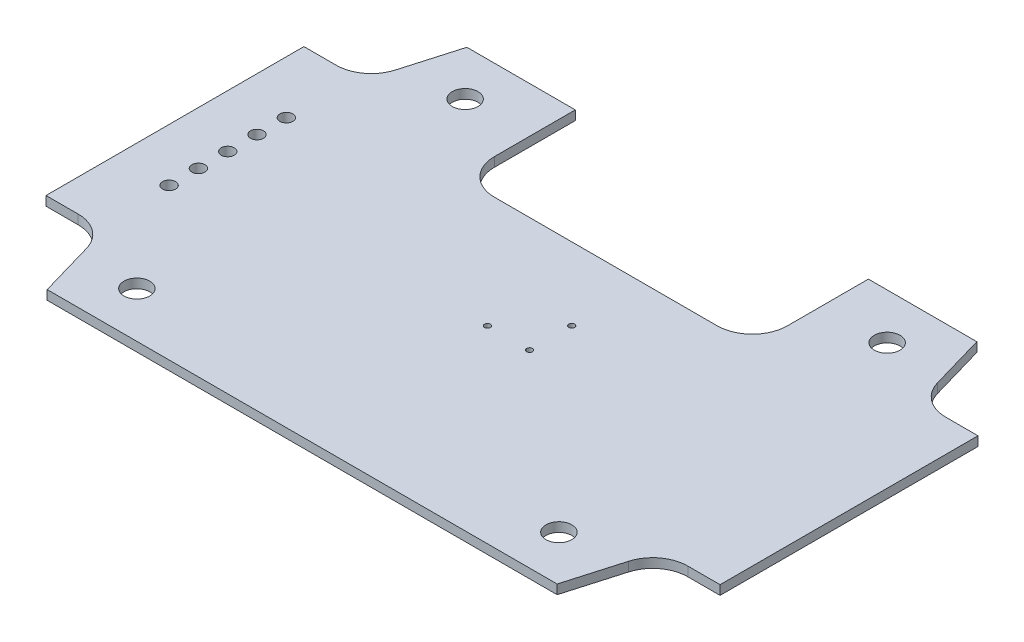
ISO-10303-21;
HEADER;
FILE_DESCRIPTION(('STEP AP214'),'2;1');
FILE_NAME('part.step','',(''),(''),'','','');
FILE_SCHEMA(('AUTOMOTIVE_DESIGN { 1 0 10303 214 1 1 1 1 }'));
ENDSEC;
DATA;
#1=APPLICATION_CONTEXT('core data for automotive mechanical design processes');
#2=APPLICATION_PROTOCOL_DEFINITION('international standard','automotive_design',2000,#1);
#3=PRODUCT_CONTEXT('',#1,'mechanical');
#4=PRODUCT('Part','Part','',(#3));
#5=PRODUCT_RELATED_PRODUCT_CATEGORY('part','',(#4));
#6=PRODUCT_DEFINITION_FORMATION('','',#4);
#7=PRODUCT_DEFINITION_CONTEXT('part definition',#1,'design');
#8=PRODUCT_DEFINITION('design','',#6,#7);
#9=PRODUCT_DEFINITION_SHAPE('','',#8);
#10=(LENGTH_UNIT() NAMED_UNIT(*) SI_UNIT(.MILLI.,.METRE.));
#11=(NAMED_UNIT(*) PLANE_ANGLE_UNIT() SI_UNIT($,.RADIAN.));
#12=(NAMED_UNIT(*) SI_UNIT($,.STERADIAN.) SOLID_ANGLE_UNIT());
#13=UNCERTAINTY_MEASURE_WITH_UNIT(LENGTH_MEASURE(1.E-05),#10,'distance_accuracy_value','');
#14=(GEOMETRIC_REPRESENTATION_CONTEXT(3) GLOBAL_UNCERTAINTY_ASSIGNED_CONTEXT((#13)) GLOBAL_UNIT_ASSIGNED_CONTEXT((#10,
#11,#12)) REPRESENTATION_CONTEXT('',''));
#15=CARTESIAN_POINT('',(0.,0.,0.));
#16=DIRECTION('',(0.,0.,1.));
#17=DIRECTION('',(1.,0.,0.));
#18=AXIS2_PLACEMENT_3D('',#15,#16,#17);
#19=CARTESIAN_POINT('',(-30.25,0.79375,17.9));
#20=DIRECTION('',(0.,0.,-1.));
#21=DIRECTION('',(-1.,0.,0.));
#22=AXIS2_PLACEMENT_3D('',#19,#20,#21);
#23=PLANE('',#22);
#24=DIRECTION('',(0.,1.,0.));
#25=VECTOR('',#24,1.);
#26=CARTESIAN_POINT('',(20.25,0.,17.9));
#27=LINE('',#26,#25);
#28=CARTESIAN_POINT('',(20.25,0.,17.9));
#29=VERTEX_POINT('',#28);
#30=CARTESIAN_POINT('',(20.25,0.79375,17.9));
#31=VERTEX_POINT('',#30);
#32=EDGE_CURVE('E216',#29,#31,#27,.T.);
#33=ORIENTED_EDGE('',*,*,#32,.T.);
#34=DIRECTION('',(1.,0.,0.));
#35=VECTOR('',#34,1.);
#36=CARTESIAN_POINT('',(-30.25,0.79375,17.9));
#37=LINE('',#36,#35);
#38=CARTESIAN_POINT('',(-23.25,0.79375,17.9));
#39=VERTEX_POINT('',#38);
#40=EDGE_CURVE('E357',#39,#31,#37,.T.);
#41=ORIENTED_EDGE('',*,*,#40,.F.);
#42=DIRECTION('',(0.,1.,0.));
#43=VECTOR('',#42,1.);
#44=CARTESIAN_POINT('',(-23.25,0.,17.9));
#45=LINE('',#44,#43);
#46=CARTESIAN_POINT('',(-23.25,0.,17.9));
#47=VERTEX_POINT('',#46);
#48=EDGE_CURVE('E229',#47,#39,#45,.T.);
#49=ORIENTED_EDGE('',*,*,#48,.F.);
#50=DIRECTION('',(1.,0.,0.));
#51=VECTOR('',#50,1.);
#52=CARTESIAN_POINT('',(-30.25,0.,17.9));
#53=LINE('',#52,#51);
#54=EDGE_CURVE('E351',#47,#29,#53,.T.);
#55=ORIENTED_EDGE('',*,*,#54,.T.);
#56=EDGE_LOOP('',(#33,#41,#49,#55));
#57=FACE_BOUND('',#56,.T.);
#58=ADVANCED_FACE('F34',(#57),#23,.F.);
#59=CARTESIAN_POINT('',(0.,0.79375,0.));
#60=DIRECTION('',(0.,-1.,0.));
#61=DIRECTION('',(0.,0.,-1.));
#62=AXIS2_PLACEMENT_3D('',#59,#60,#61);
#63=PLANE('',#62);
#64=CARTESIAN_POINT('',(16.5,0.79375,-14.));
#65=DIRECTION('',(0.,1.,0.));
#66=DIRECTION('',(0.,0.,1.));
#67=AXIS2_PLACEMENT_3D('',#64,#65,#66);
#68=CIRCLE('',#67,1.1);
#69=CARTESIAN_POINT('',(16.5,0.79375,-12.9));
#70=VERTEX_POINT('',#69);
#71=EDGE_CURVE('E817',#70,#70,#68,.T.);
#72=ORIENTED_EDGE('',*,*,#71,.F.);
#73=EDGE_LOOP('',(#72));
#74=FACE_BOUND('',#73,.T.);
#75=CARTESIAN_POINT('',(16.5,0.79375,14.));
#76=DIRECTION('',(0.,1.,0.));
#77=DIRECTION('',(0.,0.,1.));
#78=AXIS2_PLACEMENT_3D('',#75,#76,#77);
#79=CIRCLE('',#78,1.1);
#80=CARTESIAN_POINT('',(16.5,0.79375,15.1));
#81=VERTEX_POINT('',#80);
#82=EDGE_CURVE('E819',#81,#81,#79,.T.);
#83=ORIENTED_EDGE('',*,*,#82,.F.);
#84=EDGE_LOOP('',(#83));
#85=FACE_BOUND('',#84,.T.);
#86=CARTESIAN_POINT('',(-19.5,0.79375,14.));
#87=DIRECTION('',(0.,1.,0.));
#88=DIRECTION('',(0.,0.,1.));
#89=AXIS2_PLACEMENT_3D('',#86,#87,#88);
#90=CIRCLE('',#89,1.1);
#91=CARTESIAN_POINT('',(-19.5,0.79375,15.1));
#92=VERTEX_POINT('',#91);
#93=EDGE_CURVE('E825',#92,#92,#90,.T.);
#94=ORIENTED_EDGE('',*,*,#93,.F.);
#95=EDGE_LOOP('',(#94));
#96=FACE_BOUND('',#95,.T.);
#97=CARTESIAN_POINT('',(-19.5,0.79375,-14.));
#98=DIRECTION('',(0.,1.,0.));
#99=DIRECTION('',(0.,0.,1.));
#100=AXIS2_PLACEMENT_3D('',#97,#98,#99);
#101=CIRCLE('',#100,1.1);
#102=CARTESIAN_POINT('',(-19.5,0.79375,-12.9));
#103=VERTEX_POINT('',#102);
#104=EDGE_CURVE('E209',#103,#103,#101,.T.);
#105=ORIENTED_EDGE('',*,*,#104,.F.);
#106=EDGE_LOOP('',(#105));
#107=FACE_BOUND('',#106,.T.);
#108=CARTESIAN_POINT('',(-25.75,0.79375,-2.5));
#109=DIRECTION('',(0.,1.,0.));
#110=DIRECTION('',(0.,0.,1.));
#111=AXIS2_PLACEMENT_3D('',#108,#109,#110);
#112=CIRCLE('',#111,0.555000000000001);
#113=CARTESIAN_POINT('',(-25.75,0.79375,-1.945));
#114=VERTEX_POINT('',#113);
#115=EDGE_CURVE('E321',#114,#114,#112,.T.);
#116=ORIENTED_EDGE('',*,*,#115,.F.);
#117=EDGE_LOOP('',(#116));
#118=FACE_BOUND('',#117,.T.);
#119=CARTESIAN_POINT('',(-25.75,0.79375,-5.));
#120=DIRECTION('',(0.,1.,0.));
#121=DIRECTION('',(0.,0.,1.));
#122=AXIS2_PLACEMENT_3D('',#119,#120,#121);
#123=CIRCLE('',#122,0.555000000000001);
#124=CARTESIAN_POINT('',(-25.75,0.79375,-4.445));
#125=VERTEX_POINT('',#124);
#126=EDGE_CURVE('E324',#125,#125,#123,.T.);
#127=ORIENTED_EDGE('',*,*,#126,.F.);
#128=EDGE_LOOP('',(#127));
#129=FACE_BOUND('',#128,.T.);
#130=CARTESIAN_POINT('',(-1.79605122421383,0.79375,1.79605122421383));
#131=DIRECTION('',(0.,1.,0.));
#132=DIRECTION('',(0.,0.,1.));
#133=AXIS2_PLACEMENT_3D('',#130,#131,#132);
#134=CIRCLE('',#133,0.25);
#135=CARTESIAN_POINT('',(-1.79605122421383,0.79375,2.04605122421383));
#136=VERTEX_POINT('',#135);
#137=EDGE_CURVE('E328',#136,#136,#134,.T.);
#138=ORIENTED_EDGE('',*,*,#137,.F.);
#139=EDGE_LOOP('',(#138));
#140=FACE_BOUND('',#139,.T.);
#141=CARTESIAN_POINT('',(1.79605122421383,0.79375,-1.79605122421383));
#142=DIRECTION('',(0.,1.,0.));
#143=DIRECTION('',(0.,0.,1.));
#144=AXIS2_PLACEMENT_3D('',#141,#142,#143);
#145=CIRCLE('',#144,0.25);
#146=CARTESIAN_POINT('',(1.79605122421383,0.79375,-1.54605122421383));
#147=VERTEX_POINT('',#146);
#148=EDGE_CURVE('E334',#147,#147,#145,.T.);
#149=ORIENTED_EDGE('',*,*,#148,.F.);
#150=EDGE_LOOP('',(#149));
#151=FACE_BOUND('',#150,.T.);
#152=CARTESIAN_POINT('',(1.79605122421383,0.79375,1.79605122421383));
#153=DIRECTION('',(0.,1.,0.));
#154=DIRECTION('',(0.,0.,1.));
#155=AXIS2_PLACEMENT_3D('',#152,#153,#154);
#156=CIRCLE('',#155,0.25);
#157=CARTESIAN_POINT('',(1.79605122421383,0.79375,2.04605122421383));
#158=VERTEX_POINT('',#157);
#159=EDGE_CURVE('E340',#158,#158,#156,.T.);
#160=ORIENTED_EDGE('',*,*,#159,.F.);
#161=EDGE_LOOP('',(#160));
#162=FACE_BOUND('',#161,.T.);
#163=CARTESIAN_POINT('',(-25.75,0.79375,0.));
#164=DIRECTION('',(0.,1.,0.));
#165=DIRECTION('',(0.,0.,1.));
#166=AXIS2_PLACEMENT_3D('',#163,#164,#165);
#167=CIRCLE('',#166,0.555000000000001);
#168=CARTESIAN_POINT('',(-25.75,0.79375,0.555000000000001));
#169=VERTEX_POINT('',#168);
#170=EDGE_CURVE('E372',#169,#169,#167,.T.);
#171=ORIENTED_EDGE('',*,*,#170,.F.);
#172=EDGE_LOOP('',(#171));
#173=FACE_BOUND('',#172,.T.);
#174=CARTESIAN_POINT('',(-25.75,0.79375,2.5));
#175=DIRECTION('',(0.,1.,0.));
#176=DIRECTION('',(0.,0.,1.));
#177=AXIS2_PLACEMENT_3D('',#174,#175,#176);
#178=CIRCLE('',#177,0.555000000000001);
#179=CARTESIAN_POINT('',(-25.75,0.79375,3.055));
#180=VERTEX_POINT('',#179);
#181=EDGE_CURVE('E378',#180,#180,#178,.T.);
#182=ORIENTED_EDGE('',*,*,#181,.F.);
#183=EDGE_LOOP('',(#182));
#184=FACE_BOUND('',#183,.T.);
#185=CARTESIAN_POINT('',(-25.75,0.79375,5.));
#186=DIRECTION('',(0.,1.,0.));
#187=DIRECTION('',(0.,0.,1.));
#188=AXIS2_PLACEMENT_3D('',#185,#186,#187);
#189=CIRCLE('',#188,0.555000000000001);
#190=CARTESIAN_POINT('',(-25.75,0.79375,5.555));
#191=VERTEX_POINT('',#190);
#192=EDGE_CURVE('E384',#191,#191,#189,.T.);
#193=ORIENTED_EDGE('',*,*,#192,.F.);
#194=EDGE_LOOP('',(#193));
#195=FACE_BOUND('',#194,.T.);
#196=DIRECTION('',(0.277662629060631,0.,-0.960678647843876));
#197=VECTOR('',#196,1.);
#198=CARTESIAN_POINT('',(20.25,0.79375,17.9));
#199=LINE('',#198,#197);
#200=CARTESIAN_POINT('',(21.6179640564684,0.79375,13.1670121128181));
#201=VERTEX_POINT('',#200);
#202=EDGE_CURVE('E203',#31,#201,#199,.T.);
#203=ORIENTED_EDGE('',*,*,#202,.T.);
#204=CARTESIAN_POINT('',(24.5,0.79375,14.));
#205=DIRECTION('',(0.,-1.,0.));
#206=DIRECTION('',(0.,0.,-1.));
#207=AXIS2_PLACEMENT_3D('',#204,#205,#206);
#208=CIRCLE('',#207,3.);
#209=CARTESIAN_POINT('',(24.5,0.79375,11.));
#210=VERTEX_POINT('',#209);
#211=EDGE_CURVE('E206',#201,#210,#208,.T.);
#212=ORIENTED_EDGE('',*,*,#211,.T.);
#213=DIRECTION('',(1.,0.,0.));
#214=VECTOR('',#213,1.);
#215=CARTESIAN_POINT('',(24.5,0.79375,11.));
#216=LINE('',#215,#214);
#217=CARTESIAN_POINT('',(27.25,0.79375,11.));
#218=VERTEX_POINT('',#217);
#219=EDGE_CURVE('E195',#210,#218,#216,.T.);
#220=ORIENTED_EDGE('',*,*,#219,.T.);
#221=DIRECTION('',(0.,0.,-1.));
#222=VECTOR('',#221,1.);
#223=CARTESIAN_POINT('',(27.25,0.79375,17.9));
#224=LINE('',#223,#222);
#225=CARTESIAN_POINT('',(27.25,0.79375,-11.));
#226=VERTEX_POINT('',#225);
#227=EDGE_CURVE('E348',#218,#226,#224,.T.);
#228=ORIENTED_EDGE('',*,*,#227,.T.);
#229=DIRECTION('',(1.,0.,0.));
#230=VECTOR('',#229,1.);
#231=CARTESIAN_POINT('',(24.5,0.79375,-11.));
#232=LINE('',#231,#230);
#233=CARTESIAN_POINT('',(24.5,0.79375,-11.));
#234=VERTEX_POINT('',#233);
#235=EDGE_CURVE('E249',#234,#226,#232,.T.);
#236=ORIENTED_EDGE('',*,*,#235,.F.);
#237=CARTESIAN_POINT('',(24.5,0.79375,-14.));
#238=DIRECTION('',(0.,1.,0.));
#239=DIRECTION('',(0.,0.,1.));
#240=AXIS2_PLACEMENT_3D('',#237,#238,#239);
#241=CIRCLE('',#240,3.);
#242=CARTESIAN_POINT('',(21.6179640564684,0.79375,-13.1670121128181));
#243=VERTEX_POINT('',#242);
#244=EDGE_CURVE('E257',#243,#234,#241,.T.);
#245=ORIENTED_EDGE('',*,*,#244,.F.);
#246=DIRECTION('',(0.277662629060631,0.,0.960678647843876));
#247=VECTOR('',#246,1.);
#248=CARTESIAN_POINT('',(20.25,0.79375,-17.9));
#249=LINE('',#248,#247);
#250=CARTESIAN_POINT('',(20.25,0.79375,-17.9));
#251=VERTEX_POINT('',#250);
#252=EDGE_CURVE('E240',#251,#243,#249,.T.);
#253=ORIENTED_EDGE('',*,*,#252,.F.);
#254=DIRECTION('',(-1.,0.,0.));
#255=VECTOR('',#254,1.);
#256=CARTESIAN_POINT('',(-30.25,0.79375,-17.9));
#257=LINE('',#256,#255);
#258=CARTESIAN_POINT('',(11.,0.79375,-17.9));
#259=VERTEX_POINT('',#258);
#260=EDGE_CURVE('E352',#251,#259,#257,.T.);
#261=ORIENTED_EDGE('',*,*,#260,.T.);
#262=DIRECTION('',(0.,0.,1.));
#263=VECTOR('',#262,1.);
#264=CARTESIAN_POINT('',(11.,0.79375,-8.));
#265=LINE('',#264,#263);
#266=CARTESIAN_POINT('',(11.,0.79375,-11.));
#267=VERTEX_POINT('',#266);
#268=EDGE_CURVE('E299',#259,#267,#265,.T.);
#269=ORIENTED_EDGE('',*,*,#268,.T.);
#270=CARTESIAN_POINT('',(8.,0.79375,-11.));
#271=DIRECTION('',(0.,-1.,0.));
#272=DIRECTION('',(0.,0.,-1.));
#273=AXIS2_PLACEMENT_3D('',#270,#271,#272);
#274=CIRCLE('',#273,3.);
#275=CARTESIAN_POINT('',(8.,0.79375,-8.));
#276=VERTEX_POINT('',#275);
#277=EDGE_CURVE('E11',#267,#276,#274,.T.);
#278=ORIENTED_EDGE('',*,*,#277,.T.);
#279=DIRECTION('',(-1.,0.,0.));
#280=VECTOR('',#279,1.);
#281=CARTESIAN_POINT('',(11.,0.79375,-8.));
#282=LINE('',#281,#280);
#283=CARTESIAN_POINT('',(-11.,0.79375,-8.));
#284=VERTEX_POINT('',#283);
#285=EDGE_CURVE('E303',#276,#284,#282,.T.);
#286=ORIENTED_EDGE('',*,*,#285,.T.);
#287=CARTESIAN_POINT('',(-11.,0.79375,-11.));
#288=DIRECTION('',(0.,-1.,0.));
#289=DIRECTION('',(0.,0.,-1.));
#290=AXIS2_PLACEMENT_3D('',#287,#288,#289);
#291=CIRCLE('',#290,3.);
#292=CARTESIAN_POINT('',(-14.,0.79375,-11.));
#293=VERTEX_POINT('',#292);
#294=EDGE_CURVE('E399',#284,#293,#291,.T.);
#295=ORIENTED_EDGE('',*,*,#294,.T.);
#296=DIRECTION('',(0.,0.,-1.));
#297=VECTOR('',#296,1.);
#298=CARTESIAN_POINT('',(-14.,0.79375,-8.));
#299=LINE('',#298,#297);
#300=CARTESIAN_POINT('',(-14.,0.79375,-17.9));
#301=VERTEX_POINT('',#300);
#302=EDGE_CURVE('E297',#293,#301,#299,.T.);
#303=ORIENTED_EDGE('',*,*,#302,.T.);
#304=CARTESIAN_POINT('',(-23.25,0.79375,-17.9));
#305=VERTEX_POINT('',#304);
#306=EDGE_CURVE('E350',#301,#305,#257,.T.);
#307=ORIENTED_EDGE('',*,*,#306,.T.);
#308=DIRECTION('',(0.277662629060633,0.,-0.960678647843876));
#309=VECTOR('',#308,1.);
#310=CARTESIAN_POINT('',(-24.6179640564684,0.79375,-13.1670121128181));
#311=LINE('',#310,#309);
#312=CARTESIAN_POINT('',(-24.6179640564684,0.79375,-13.1670121128181));
#313=VERTEX_POINT('',#312);
#314=EDGE_CURVE('E275',#313,#305,#311,.T.);
#315=ORIENTED_EDGE('',*,*,#314,.F.);
#316=CARTESIAN_POINT('',(-27.5,0.79375,-14.));
#317=DIRECTION('',(0.,1.,0.));
#318=DIRECTION('',(0.,0.,1.));
#319=AXIS2_PLACEMENT_3D('',#316,#317,#318);
#320=CIRCLE('',#319,3.);
#321=CARTESIAN_POINT('',(-27.5,0.79375,-11.));
#322=VERTEX_POINT('',#321);
#323=EDGE_CURVE('E284',#322,#313,#320,.T.);
#324=ORIENTED_EDGE('',*,*,#323,.F.);
#325=DIRECTION('',(1.,0.,0.));
#326=VECTOR('',#325,1.);
#327=CARTESIAN_POINT('',(-30.25,0.79375,-11.));
#328=LINE('',#327,#326);
#329=CARTESIAN_POINT('',(-30.25,0.79375,-11.));
#330=VERTEX_POINT('',#329);
#331=EDGE_CURVE('E265',#330,#322,#328,.T.);
#332=ORIENTED_EDGE('',*,*,#331,.F.);
#333=DIRECTION('',(0.,0.,1.));
#334=VECTOR('',#333,1.);
#335=CARTESIAN_POINT('',(-30.25,0.79375,17.9));
#336=LINE('',#335,#334);
#337=CARTESIAN_POINT('',(-30.25,0.79375,11.));
#338=VERTEX_POINT('',#337);
#339=EDGE_CURVE('E354',#330,#338,#336,.T.);
#340=ORIENTED_EDGE('',*,*,#339,.T.);
#341=DIRECTION('',(1.,0.,0.));
#342=VECTOR('',#341,1.);
#343=CARTESIAN_POINT('',(-30.25,0.79375,11.));
#344=LINE('',#343,#342);
#345=CARTESIAN_POINT('',(-27.5,0.79375,11.));
#346=VERTEX_POINT('',#345);
#347=EDGE_CURVE('E225',#338,#346,#344,.T.);
#348=ORIENTED_EDGE('',*,*,#347,.T.);
#349=CARTESIAN_POINT('',(-27.5,0.79375,14.));
#350=DIRECTION('',(0.,-1.,0.));
#351=DIRECTION('',(0.,0.,-1.));
#352=AXIS2_PLACEMENT_3D('',#349,#350,#351);
#353=CIRCLE('',#352,3.);
#354=CARTESIAN_POINT('',(-24.6179640564684,0.79375,13.1670121128181));
#355=VERTEX_POINT('',#354);
#356=EDGE_CURVE('E232',#346,#355,#353,.T.);
#357=ORIENTED_EDGE('',*,*,#356,.T.);
#358=DIRECTION('',(0.277662629060633,0.,0.960678647843876));
#359=VECTOR('',#358,1.);
#360=CARTESIAN_POINT('',(-24.6179640564684,0.79375,13.1670121128181));
#361=LINE('',#360,#359);
#362=EDGE_CURVE('E219',#355,#39,#361,.T.);
#363=ORIENTED_EDGE('',*,*,#362,.T.);
#364=ORIENTED_EDGE('',*,*,#40,.T.);
#365=EDGE_LOOP('',(#203,#212,#220,#228,#236,#245,#253,#261,#269,#278,#286,#295,#303,#307,#315,
#324,#332,#340,#348,#357,#363,#364));
#366=FACE_BOUND('',#365,.T.);
#367=ADVANCED_FACE('F413',(#74,#85,#96,#107,#118,#129,#140,#151,#162,#173,#184,#195,#366),#63,.F.);
#368=CARTESIAN_POINT('',(0.,0.,0.));
#369=DIRECTION('',(0.,-1.,0.));
#370=DIRECTION('',(0.,0.,-1.));
#371=AXIS2_PLACEMENT_3D('',#368,#369,#370);
#372=PLANE('',#371);
#373=CARTESIAN_POINT('',(16.5,0.,-14.));
#374=DIRECTION('',(0.,1.,0.));
#375=DIRECTION('',(0.,0.,1.));
#376=AXIS2_PLACEMENT_3D('',#373,#374,#375);
#377=CIRCLE('',#376,1.1);
#378=CARTESIAN_POINT('',(16.5,0.,-12.9));
#379=VERTEX_POINT('',#378);
#380=EDGE_CURVE('E814',#379,#379,#377,.T.);
#381=ORIENTED_EDGE('',*,*,#380,.T.);
#382=EDGE_LOOP('',(#381));
#383=FACE_BOUND('',#382,.T.);
#384=CARTESIAN_POINT('',(16.5,0.,14.));
#385=DIRECTION('',(0.,1.,0.));
#386=DIRECTION('',(0.,0.,1.));
#387=AXIS2_PLACEMENT_3D('',#384,#385,#386);
#388=CIRCLE('',#387,1.1);
#389=CARTESIAN_POINT('',(16.5,0.,15.1));
#390=VERTEX_POINT('',#389);
#391=EDGE_CURVE('E822',#390,#390,#388,.T.);
#392=ORIENTED_EDGE('',*,*,#391,.T.);
#393=EDGE_LOOP('',(#392));
#394=FACE_BOUND('',#393,.T.);
#395=CARTESIAN_POINT('',(-19.5,0.,14.));
#396=DIRECTION('',(0.,1.,0.));
#397=DIRECTION('',(0.,0.,1.));
#398=AXIS2_PLACEMENT_3D('',#395,#396,#397);
#399=CIRCLE('',#398,1.1);
#400=CARTESIAN_POINT('',(-19.5,0.,15.1));
#401=VERTEX_POINT('',#400);
#402=EDGE_CURVE('E828',#401,#401,#399,.T.);
#403=ORIENTED_EDGE('',*,*,#402,.T.);
#404=EDGE_LOOP('',(#403));
#405=FACE_BOUND('',#404,.T.);
#406=CARTESIAN_POINT('',(-19.5,0.,-14.));
#407=DIRECTION('',(0.,1.,0.));
#408=DIRECTION('',(0.,0.,1.));
#409=AXIS2_PLACEMENT_3D('',#406,#407,#408);
#410=CIRCLE('',#409,1.1);
#411=CARTESIAN_POINT('',(-19.5,0.,-12.9));
#412=VERTEX_POINT('',#411);
#413=EDGE_CURVE('E214',#412,#412,#410,.T.);
#414=ORIENTED_EDGE('',*,*,#413,.T.);
#415=EDGE_LOOP('',(#414));
#416=FACE_BOUND('',#415,.T.);
#417=CARTESIAN_POINT('',(-25.75,0.,-2.5));
#418=DIRECTION('',(0.,1.,0.));
#419=DIRECTION('',(0.,0.,1.));
#420=AXIS2_PLACEMENT_3D('',#417,#418,#419);
#421=CIRCLE('',#420,0.555000000000001);
#422=CARTESIAN_POINT('',(-25.75,0.,-1.945));
#423=VERTEX_POINT('',#422);
#424=EDGE_CURVE('E316',#423,#423,#421,.T.);
#425=ORIENTED_EDGE('',*,*,#424,.T.);
#426=EDGE_LOOP('',(#425));
#427=FACE_BOUND('',#426,.T.);
#428=CARTESIAN_POINT('',(-25.75,0.,-5.));
#429=DIRECTION('',(0.,1.,0.));
#430=DIRECTION('',(0.,0.,1.));
#431=AXIS2_PLACEMENT_3D('',#428,#429,#430);
#432=CIRCLE('',#431,0.555000000000001);
#433=CARTESIAN_POINT('',(-25.75,0.,-4.445));
#434=VERTEX_POINT('',#433);
#435=EDGE_CURVE('E325',#434,#434,#432,.T.);
#436=ORIENTED_EDGE('',*,*,#435,.T.);
#437=EDGE_LOOP('',(#436));
#438=FACE_BOUND('',#437,.T.);
#439=CARTESIAN_POINT('',(-1.79605122421383,0.,1.79605122421383));
#440=DIRECTION('',(0.,1.,0.));
#441=DIRECTION('',(0.,0.,1.));
#442=AXIS2_PLACEMENT_3D('',#439,#440,#441);
#443=CIRCLE('',#442,0.25);
#444=CARTESIAN_POINT('',(-1.79605122421383,0.,2.04605122421383));
#445=VERTEX_POINT('',#444);
#446=EDGE_CURVE('E331',#445,#445,#443,.T.);
#447=ORIENTED_EDGE('',*,*,#446,.T.);
#448=EDGE_LOOP('',(#447));
#449=FACE_BOUND('',#448,.T.);
#450=CARTESIAN_POINT('',(1.79605122421383,0.,-1.79605122421383));
#451=DIRECTION('',(0.,1.,0.));
#452=DIRECTION('',(0.,0.,1.));
#453=AXIS2_PLACEMENT_3D('',#450,#451,#452);
#454=CIRCLE('',#453,0.25);
#455=CARTESIAN_POINT('',(1.79605122421383,0.,-1.54605122421383));
#456=VERTEX_POINT('',#455);
#457=EDGE_CURVE('E337',#456,#456,#454,.T.);
#458=ORIENTED_EDGE('',*,*,#457,.T.);
#459=EDGE_LOOP('',(#458));
#460=FACE_BOUND('',#459,.T.);
#461=CARTESIAN_POINT('',(1.79605122421383,0.,1.79605122421383));
#462=DIRECTION('',(0.,1.,0.));
#463=DIRECTION('',(0.,0.,1.));
#464=AXIS2_PLACEMENT_3D('',#461,#462,#463);
#465=CIRCLE('',#464,0.25);
#466=CARTESIAN_POINT('',(1.79605122421383,0.,2.04605122421383));
#467=VERTEX_POINT('',#466);
#468=EDGE_CURVE('E343',#467,#467,#465,.T.);
#469=ORIENTED_EDGE('',*,*,#468,.T.);
#470=EDGE_LOOP('',(#469));
#471=FACE_BOUND('',#470,.T.);
#472=CARTESIAN_POINT('',(-25.75,0.,0.));
#473=DIRECTION('',(0.,1.,0.));
#474=DIRECTION('',(0.,0.,1.));
#475=AXIS2_PLACEMENT_3D('',#472,#473,#474);
#476=CIRCLE('',#475,0.555000000000001);
#477=CARTESIAN_POINT('',(-25.75,0.,0.555000000000001));
#478=VERTEX_POINT('',#477);
#479=EDGE_CURVE('E360',#478,#478,#476,.T.);
#480=ORIENTED_EDGE('',*,*,#479,.T.);
#481=EDGE_LOOP('',(#480));
#482=FACE_BOUND('',#481,.T.);
#483=CARTESIAN_POINT('',(-25.75,0.,2.5));
#484=DIRECTION('',(0.,1.,0.));
#485=DIRECTION('',(0.,0.,1.));
#486=AXIS2_PLACEMENT_3D('',#483,#484,#485);
#487=CIRCLE('',#486,0.555000000000001);
#488=CARTESIAN_POINT('',(-25.75,0.,3.055));
#489=VERTEX_POINT('',#488);
#490=EDGE_CURVE('E375',#489,#489,#487,.T.);
#491=ORIENTED_EDGE('',*,*,#490,.T.);
#492=EDGE_LOOP('',(#491));
#493=FACE_BOUND('',#492,.T.);
#494=CARTESIAN_POINT('',(-25.75,0.,5.));
#495=DIRECTION('',(0.,1.,0.));
#496=DIRECTION('',(0.,0.,1.));
#497=AXIS2_PLACEMENT_3D('',#494,#495,#496);
#498=CIRCLE('',#497,0.555000000000001);
#499=CARTESIAN_POINT('',(-25.75,0.,5.555));
#500=VERTEX_POINT('',#499);
#501=EDGE_CURVE('E381',#500,#500,#498,.T.);
#502=ORIENTED_EDGE('',*,*,#501,.T.);
#503=EDGE_LOOP('',(#502));
#504=FACE_BOUND('',#503,.T.);
#505=CARTESIAN_POINT('',(24.5,0.,14.));
#506=DIRECTION('',(0.,-1.,0.));
#507=DIRECTION('',(0.,0.,-1.));
#508=AXIS2_PLACEMENT_3D('',#505,#506,#507);
#509=CIRCLE('',#508,3.);
#510=CARTESIAN_POINT('',(21.6179640564684,0.,13.1670121128181));
#511=VERTEX_POINT('',#510);
#512=CARTESIAN_POINT('',(24.5,0.,11.));
#513=VERTEX_POINT('',#512);
#514=EDGE_CURVE('E183',#511,#513,#509,.T.);
#515=ORIENTED_EDGE('',*,*,#514,.F.);
#516=DIRECTION('',(0.277662629060631,0.,-0.960678647843876));
#517=VECTOR('',#516,1.);
#518=CARTESIAN_POINT('',(20.25,0.,17.9));
#519=LINE('',#518,#517);
#520=EDGE_CURVE('E191',#29,#511,#519,.T.);
#521=ORIENTED_EDGE('',*,*,#520,.F.);
#522=ORIENTED_EDGE('',*,*,#54,.F.);
#523=DIRECTION('',(0.277662629060633,0.,0.960678647843876));
#524=VECTOR('',#523,1.);
#525=CARTESIAN_POINT('',(-24.6179640564684,0.,13.1670121128181));
#526=LINE('',#525,#524);
#527=CARTESIAN_POINT('',(-24.6179640564684,0.,13.1670121128181));
#528=VERTEX_POINT('',#527);
#529=EDGE_CURVE('E222',#528,#47,#526,.T.);
#530=ORIENTED_EDGE('',*,*,#529,.F.);
#531=CARTESIAN_POINT('',(-27.5,0.,14.));
#532=DIRECTION('',(0.,-1.,0.));
#533=DIRECTION('',(0.,0.,-1.));
#534=AXIS2_PLACEMENT_3D('',#531,#532,#533);
#535=CIRCLE('',#534,3.);
#536=CARTESIAN_POINT('',(-27.5,0.,11.));
#537=VERTEX_POINT('',#536);
#538=EDGE_CURVE('E224',#537,#528,#535,.T.);
#539=ORIENTED_EDGE('',*,*,#538,.F.);
#540=DIRECTION('',(1.,0.,0.));
#541=VECTOR('',#540,1.);
#542=CARTESIAN_POINT('',(-30.25,0.,11.));
#543=LINE('',#542,#541);
#544=CARTESIAN_POINT('',(-30.25,0.,11.));
#545=VERTEX_POINT('',#544);
#546=EDGE_CURVE('E227',#545,#537,#543,.T.);
#547=ORIENTED_EDGE('',*,*,#546,.F.);
#548=DIRECTION('',(0.,0.,1.));
#549=VECTOR('',#548,1.);
#550=CARTESIAN_POINT('',(-30.25,0.,17.9));
#551=LINE('',#550,#549);
#552=CARTESIAN_POINT('',(-30.25,0.,-11.));
#553=VERTEX_POINT('',#552);
#554=EDGE_CURVE('E365',#553,#545,#551,.T.);
#555=ORIENTED_EDGE('',*,*,#554,.F.);
#556=DIRECTION('',(1.,0.,0.));
#557=VECTOR('',#556,1.);
#558=CARTESIAN_POINT('',(-30.25,0.,-11.));
#559=LINE('',#558,#557);
#560=CARTESIAN_POINT('',(-27.5,0.,-11.));
#561=VERTEX_POINT('',#560);
#562=EDGE_CURVE('E271',#553,#561,#559,.T.);
#563=ORIENTED_EDGE('',*,*,#562,.T.);
#564=CARTESIAN_POINT('',(-27.5,0.,-14.));
#565=DIRECTION('',(0.,1.,0.));
#566=DIRECTION('',(0.,0.,1.));
#567=AXIS2_PLACEMENT_3D('',#564,#565,#566);
#568=CIRCLE('',#567,3.);
#569=CARTESIAN_POINT('',(-24.6179640564684,0.,-13.1670121128181));
#570=VERTEX_POINT('',#569);
#571=EDGE_CURVE('E274',#561,#570,#568,.T.);
#572=ORIENTED_EDGE('',*,*,#571,.T.);
#573=DIRECTION('',(0.277662629060633,0.,-0.960678647843876));
#574=VECTOR('',#573,1.);
#575=CARTESIAN_POINT('',(-24.6179640564684,0.,-13.1670121128181));
#576=LINE('',#575,#574);
#577=CARTESIAN_POINT('',(-23.25,0.,-17.9));
#578=VERTEX_POINT('',#577);
#579=EDGE_CURVE('E278',#570,#578,#576,.T.);
#580=ORIENTED_EDGE('',*,*,#579,.T.);
#581=DIRECTION('',(-1.,0.,0.));
#582=VECTOR('',#581,1.);
#583=CARTESIAN_POINT('',(-30.25,0.,-17.9));
#584=LINE('',#583,#582);
#585=CARTESIAN_POINT('',(-14.,0.,-17.9));
#586=VERTEX_POINT('',#585);
#587=EDGE_CURVE('E362',#586,#578,#584,.T.);
#588=ORIENTED_EDGE('',*,*,#587,.F.);
#589=DIRECTION('',(0.,0.,-1.));
#590=VECTOR('',#589,1.);
#591=CARTESIAN_POINT('',(-14.,0.,-8.));
#592=LINE('',#591,#590);
#593=CARTESIAN_POINT('',(-14.,0.,-11.));
#594=VERTEX_POINT('',#593);
#595=EDGE_CURVE('E291',#594,#586,#592,.T.);
#596=ORIENTED_EDGE('',*,*,#595,.F.);
#597=CARTESIAN_POINT('',(-11.,0.,-11.));
#598=DIRECTION('',(0.,-1.,0.));
#599=DIRECTION('',(0.,0.,-1.));
#600=AXIS2_PLACEMENT_3D('',#597,#598,#599);
#601=CIRCLE('',#600,3.);
#602=CARTESIAN_POINT('',(-11.,0.,-8.));
#603=VERTEX_POINT('',#602);
#604=EDGE_CURVE('E397',#594,#603,#601,.F.);
#605=ORIENTED_EDGE('',*,*,#604,.T.);
#606=DIRECTION('',(-1.,0.,0.));
#607=VECTOR('',#606,1.);
#608=CARTESIAN_POINT('',(11.,0.,-8.));
#609=LINE('',#608,#607);
#610=CARTESIAN_POINT('',(8.,0.,-8.));
#611=VERTEX_POINT('',#610);
#612=EDGE_CURVE('E300',#611,#603,#609,.T.);
#613=ORIENTED_EDGE('',*,*,#612,.F.);
#614=CARTESIAN_POINT('',(8.,0.,-11.));
#615=DIRECTION('',(0.,-1.,0.));
#616=DIRECTION('',(0.,0.,-1.));
#617=AXIS2_PLACEMENT_3D('',#614,#615,#616);
#618=CIRCLE('',#617,3.);
#619=CARTESIAN_POINT('',(11.,0.,-11.));
#620=VERTEX_POINT('',#619);
#621=EDGE_CURVE('E42',#611,#620,#618,.F.);
#622=ORIENTED_EDGE('',*,*,#621,.T.);
#623=DIRECTION('',(0.,0.,1.));
#624=VECTOR('',#623,1.);
#625=CARTESIAN_POINT('',(11.,0.,-8.));
#626=LINE('',#625,#624);
#627=CARTESIAN_POINT('',(11.,0.,-17.9));
#628=VERTEX_POINT('',#627);
#629=EDGE_CURVE('E308',#628,#620,#626,.T.);
#630=ORIENTED_EDGE('',*,*,#629,.F.);
#631=CARTESIAN_POINT('',(20.25,0.,-17.9));
#632=VERTEX_POINT('',#631);
#633=EDGE_CURVE('E363',#632,#628,#584,.T.);
#634=ORIENTED_EDGE('',*,*,#633,.F.);
#635=DIRECTION('',(0.277662629060631,0.,0.960678647843876));
#636=VECTOR('',#635,1.);
#637=CARTESIAN_POINT('',(20.25,0.,-17.9));
#638=LINE('',#637,#636);
#639=CARTESIAN_POINT('',(21.6179640564684,0.,-13.1670121128181));
#640=VERTEX_POINT('',#639);
#641=EDGE_CURVE('E245',#632,#640,#638,.T.);
#642=ORIENTED_EDGE('',*,*,#641,.T.);
#643=CARTESIAN_POINT('',(24.5,0.,-14.));
#644=DIRECTION('',(0.,1.,0.));
#645=DIRECTION('',(0.,0.,1.));
#646=AXIS2_PLACEMENT_3D('',#643,#644,#645);
#647=CIRCLE('',#646,3.);
#648=CARTESIAN_POINT('',(24.5,0.,-11.));
#649=VERTEX_POINT('',#648);
#650=EDGE_CURVE('E248',#640,#649,#647,.T.);
#651=ORIENTED_EDGE('',*,*,#650,.T.);
#652=DIRECTION('',(1.,0.,0.));
#653=VECTOR('',#652,1.);
#654=CARTESIAN_POINT('',(24.5,0.,-11.));
#655=LINE('',#654,#653);
#656=CARTESIAN_POINT('',(27.25,0.,-11.));
#657=VERTEX_POINT('',#656);
#658=EDGE_CURVE('E252',#649,#657,#655,.T.);
#659=ORIENTED_EDGE('',*,*,#658,.T.);
#660=DIRECTION('',(0.,0.,-1.));
#661=VECTOR('',#660,1.);
#662=CARTESIAN_POINT('',(27.25,0.,17.9));
#663=LINE('',#662,#661);
#664=CARTESIAN_POINT('',(27.25,0.,11.));
#665=VERTEX_POINT('',#664);
#666=EDGE_CURVE('E202',#665,#657,#663,.T.);
#667=ORIENTED_EDGE('',*,*,#666,.F.);
#668=DIRECTION('',(1.,0.,0.));
#669=VECTOR('',#668,1.);
#670=CARTESIAN_POINT('',(24.5,0.,11.));
#671=LINE('',#670,#669);
#672=EDGE_CURVE('E49',#513,#665,#671,.T.);
#673=ORIENTED_EDGE('',*,*,#672,.F.);
#674=EDGE_LOOP('',(#515,#521,#522,#530,#539,#547,#555,#563,#572,#580,#588,#596,#605,#613,#622,
#630,#634,#642,#651,#659,#667,#673));
#675=FACE_BOUND('',#674,.T.);
#676=ADVANCED_FACE('F200',(#383,#394,#405,#416,#427,#438,#449,#460,#471,#482,#493,#504,#675),
#372,.T.);
#677=CARTESIAN_POINT('',(27.25,0.79375,17.9));
#678=DIRECTION('',(-1.,0.,0.));
#679=DIRECTION('',(0.,0.,1.));
#680=AXIS2_PLACEMENT_3D('',#677,#678,#679);
#681=PLANE('',#680);
#682=DIRECTION('',(0.,1.,0.));
#683=VECTOR('',#682,1.);
#684=CARTESIAN_POINT('',(27.25,0.,11.));
#685=LINE('',#684,#683);
#686=EDGE_CURVE('E197',#665,#218,#685,.T.);
#687=ORIENTED_EDGE('',*,*,#686,.F.);
#688=ORIENTED_EDGE('',*,*,#666,.T.);
#689=DIRECTION('',(0.,1.,0.));
#690=VECTOR('',#689,1.);
#691=CARTESIAN_POINT('',(27.25,0.,-11.));
#692=LINE('',#691,#690);
#693=EDGE_CURVE('E262',#657,#226,#692,.T.);
#694=ORIENTED_EDGE('',*,*,#693,.T.);
#695=ORIENTED_EDGE('',*,*,#227,.F.);
#696=EDGE_LOOP('',(#687,#688,#694,#695));
#697=FACE_BOUND('',#696,.T.);
#698=ADVANCED_FACE('F466',(#697),#681,.F.);
#699=CARTESIAN_POINT('',(-30.25,0.79375,17.9));
#700=DIRECTION('',(1.,0.,0.));
#701=DIRECTION('',(0.,0.,-1.));
#702=AXIS2_PLACEMENT_3D('',#699,#700,#701);
#703=PLANE('',#702);
#704=DIRECTION('',(0.,1.,0.));
#705=VECTOR('',#704,1.);
#706=CARTESIAN_POINT('',(-30.25,0.,11.));
#707=LINE('',#706,#705);
#708=EDGE_CURVE('E237',#545,#338,#707,.T.);
#709=ORIENTED_EDGE('',*,*,#708,.T.);
#710=ORIENTED_EDGE('',*,*,#339,.F.);
#711=DIRECTION('',(0.,1.,0.));
#712=VECTOR('',#711,1.);
#713=CARTESIAN_POINT('',(-30.25,0.,-11.));
#714=LINE('',#713,#712);
#715=EDGE_CURVE('E281',#553,#330,#714,.T.);
#716=ORIENTED_EDGE('',*,*,#715,.F.);
#717=ORIENTED_EDGE('',*,*,#554,.T.);
#718=EDGE_LOOP('',(#709,#710,#716,#717));
#719=FACE_BOUND('',#718,.T.);
#720=ADVANCED_FACE('F446',(#719),#703,.F.);
#721=CARTESIAN_POINT('',(-30.25,0.79375,-17.9));
#722=DIRECTION('',(0.,0.,1.));
#723=DIRECTION('',(1.,0.,0.));
#724=AXIS2_PLACEMENT_3D('',#721,#722,#723);
#725=PLANE('',#724);
#726=ORIENTED_EDGE('',*,*,#587,.T.);
#727=DIRECTION('',(0.,1.,0.));
#728=VECTOR('',#727,1.);
#729=CARTESIAN_POINT('',(-23.25,0.,-17.9));
#730=LINE('',#729,#728);
#731=EDGE_CURVE('E288',#578,#305,#730,.T.);
#732=ORIENTED_EDGE('',*,*,#731,.T.);
#733=ORIENTED_EDGE('',*,*,#306,.F.);
#734=DIRECTION('',(0.,-1.,0.));
#735=VECTOR('',#734,1.);
#736=CARTESIAN_POINT('',(-14.,0.79375,-17.9));
#737=LINE('',#736,#735);
#738=EDGE_CURVE('E306',#301,#586,#737,.T.);
#739=ORIENTED_EDGE('',*,*,#738,.T.);
#740=EDGE_LOOP('',(#726,#732,#733,#739));
#741=FACE_BOUND('',#740,.T.);
#742=ADVANCED_FACE('F431',(#741),#725,.F.);
#743=ORIENTED_EDGE('',*,*,#260,.F.);
#744=DIRECTION('',(0.,1.,0.));
#745=VECTOR('',#744,1.);
#746=CARTESIAN_POINT('',(20.25,0.,-17.9));
#747=LINE('',#746,#745);
#748=EDGE_CURVE('E254',#632,#251,#747,.T.);
#749=ORIENTED_EDGE('',*,*,#748,.F.);
#750=ORIENTED_EDGE('',*,*,#633,.T.);
#751=DIRECTION('',(0.,-1.,0.));
#752=VECTOR('',#751,1.);
#753=CARTESIAN_POINT('',(11.,0.79375,-17.9));
#754=LINE('',#753,#752);
#755=EDGE_CURVE('E313',#259,#628,#754,.T.);
#756=ORIENTED_EDGE('',*,*,#755,.F.);
#757=EDGE_LOOP('',(#743,#749,#750,#756));
#758=FACE_BOUND('',#757,.T.);
#759=ADVANCED_FACE('F481',(#758),#725,.F.);
#760=CARTESIAN_POINT('',(1.79605122421383,0.,1.79605122421383));
#761=DIRECTION('',(0.,1.,0.));
#762=DIRECTION('',(0.,0.,1.));
#763=AXIS2_PLACEMENT_3D('',#760,#761,#762);
#764=CYLINDRICAL_SURFACE('',#763,0.25);
#765=ORIENTED_EDGE('',*,*,#468,.F.);
#766=EDGE_LOOP('',(#765));
#767=FACE_BOUND('',#766,.T.);
#768=ORIENTED_EDGE('',*,*,#159,.T.);
#769=EDGE_LOOP('',(#768));
#770=FACE_BOUND('',#769,.T.);
#771=ADVANCED_FACE('F483',(#767,#770),#764,.F.);
#772=CARTESIAN_POINT('',(1.79605122421383,0.,-1.79605122421383));
#773=DIRECTION('',(0.,1.,0.));
#774=DIRECTION('',(0.,0.,1.));
#775=AXIS2_PLACEMENT_3D('',#772,#773,#774);
#776=CYLINDRICAL_SURFACE('',#775,0.25);
#777=ORIENTED_EDGE('',*,*,#457,.F.);
#778=EDGE_LOOP('',(#777));
#779=FACE_BOUND('',#778,.T.);
#780=ORIENTED_EDGE('',*,*,#148,.T.);
#781=EDGE_LOOP('',(#780));
#782=FACE_BOUND('',#781,.T.);
#783=ADVANCED_FACE('F489',(#779,#782),#776,.F.);
#784=CARTESIAN_POINT('',(-1.79605122421383,0.,1.79605122421383));
#785=DIRECTION('',(0.,1.,0.));
#786=DIRECTION('',(0.,0.,1.));
#787=AXIS2_PLACEMENT_3D('',#784,#785,#786);
#788=CYLINDRICAL_SURFACE('',#787,0.25);
#789=ORIENTED_EDGE('',*,*,#446,.F.);
#790=EDGE_LOOP('',(#789));
#791=FACE_BOUND('',#790,.T.);
#792=ORIENTED_EDGE('',*,*,#137,.T.);
#793=EDGE_LOOP('',(#792));
#794=FACE_BOUND('',#793,.T.);
#795=ADVANCED_FACE('F543',(#791,#794),#788,.F.);
#796=CARTESIAN_POINT('',(-25.75,0.,-5.));
#797=DIRECTION('',(0.,1.,0.));
#798=DIRECTION('',(0.,0.,1.));
#799=AXIS2_PLACEMENT_3D('',#796,#797,#798);
#800=CYLINDRICAL_SURFACE('',#799,0.555000000000001);
#801=ORIENTED_EDGE('',*,*,#435,.F.);
#802=EDGE_LOOP('',(#801));
#803=FACE_BOUND('',#802,.T.);
#804=ORIENTED_EDGE('',*,*,#126,.T.);
#805=EDGE_LOOP('',(#804));
#806=FACE_BOUND('',#805,.T.);
#807=ADVANCED_FACE('F539',(#803,#806),#800,.F.);
#808=CARTESIAN_POINT('',(-25.75,0.,-2.5));
#809=DIRECTION('',(0.,1.,0.));
#810=DIRECTION('',(0.,0.,1.));
#811=AXIS2_PLACEMENT_3D('',#808,#809,#810);
#812=CYLINDRICAL_SURFACE('',#811,0.555000000000001);
#813=ORIENTED_EDGE('',*,*,#424,.F.);
#814=EDGE_LOOP('',(#813));
#815=FACE_BOUND('',#814,.T.);
#816=ORIENTED_EDGE('',*,*,#115,.T.);
#817=EDGE_LOOP('',(#816));
#818=FACE_BOUND('',#817,.T.);
#819=ADVANCED_FACE('F515',(#815,#818),#812,.F.);
#820=CARTESIAN_POINT('',(-25.75,0.,0.));
#821=DIRECTION('',(0.,1.,0.));
#822=DIRECTION('',(0.,0.,1.));
#823=AXIS2_PLACEMENT_3D('',#820,#821,#822);
#824=CYLINDRICAL_SURFACE('',#823,0.555000000000001);
#825=ORIENTED_EDGE('',*,*,#479,.F.);
#826=EDGE_LOOP('',(#825));
#827=FACE_BOUND('',#826,.T.);
#828=ORIENTED_EDGE('',*,*,#170,.T.);
#829=EDGE_LOOP('',(#828));
#830=FACE_BOUND('',#829,.T.);
#831=ADVANCED_FACE('F511',(#827,#830),#824,.F.);
#832=CARTESIAN_POINT('',(-25.75,0.,2.5));
#833=DIRECTION('',(0.,1.,0.));
#834=DIRECTION('',(0.,0.,1.));
#835=AXIS2_PLACEMENT_3D('',#832,#833,#834);
#836=CYLINDRICAL_SURFACE('',#835,0.555000000000001);
#837=ORIENTED_EDGE('',*,*,#490,.F.);
#838=EDGE_LOOP('',(#837));
#839=FACE_BOUND('',#838,.T.);
#840=ORIENTED_EDGE('',*,*,#181,.T.);
#841=EDGE_LOOP('',(#840));
#842=FACE_BOUND('',#841,.T.);
#843=ADVANCED_FACE('F514',(#839,#842),#836,.F.);
#844=CARTESIAN_POINT('',(-25.75,0.,5.));
#845=DIRECTION('',(0.,1.,0.));
#846=DIRECTION('',(0.,0.,1.));
#847=AXIS2_PLACEMENT_3D('',#844,#845,#846);
#848=CYLINDRICAL_SURFACE('',#847,0.555000000000001);
#849=ORIENTED_EDGE('',*,*,#501,.F.);
#850=EDGE_LOOP('',(#849));
#851=FACE_BOUND('',#850,.T.);
#852=ORIENTED_EDGE('',*,*,#192,.T.);
#853=EDGE_LOOP('',(#852));
#854=FACE_BOUND('',#853,.T.);
#855=ADVANCED_FACE('F519',(#851,#854),#848,.F.);
#856=CARTESIAN_POINT('',(-14.,0.79375,-8.));
#857=DIRECTION('',(-1.,0.,0.));
#858=DIRECTION('',(0.,0.,1.));
#859=AXIS2_PLACEMENT_3D('',#856,#857,#858);
#860=PLANE('',#859);
#861=ORIENTED_EDGE('',*,*,#302,.F.);
#862=DIRECTION('',(0.,-1.,0.));
#863=VECTOR('',#862,1.);
#864=CARTESIAN_POINT('',(-14.,0.,-11.));
#865=LINE('',#864,#863);
#866=EDGE_CURVE('E387',#293,#594,#865,.T.);
#867=ORIENTED_EDGE('',*,*,#866,.T.);
#868=ORIENTED_EDGE('',*,*,#595,.T.);
#869=ORIENTED_EDGE('',*,*,#738,.F.);
#870=EDGE_LOOP('',(#861,#867,#868,#869));
#871=FACE_BOUND('',#870,.T.);
#872=ADVANCED_FACE('F425',(#871),#860,.F.);
#873=CARTESIAN_POINT('',(11.,0.79375,-8.));
#874=DIRECTION('',(0.,0.,1.));
#875=DIRECTION('',(1.,0.,0.));
#876=AXIS2_PLACEMENT_3D('',#873,#874,#875);
#877=PLANE('',#876);
#878=ORIENTED_EDGE('',*,*,#612,.T.);
#879=DIRECTION('',(0.,-1.,0.));
#880=VECTOR('',#879,1.);
#881=CARTESIAN_POINT('',(-11.,0.79375,-8.));
#882=LINE('',#881,#880);
#883=EDGE_CURVE('E393',#603,#284,#882,.F.);
#884=ORIENTED_EDGE('',*,*,#883,.T.);
#885=ORIENTED_EDGE('',*,*,#285,.F.);
#886=DIRECTION('',(0.,-1.,0.));
#887=VECTOR('',#886,1.);
#888=CARTESIAN_POINT('',(8.,0.,-8.));
#889=LINE('',#888,#887);
#890=EDGE_CURVE('E390',#276,#611,#889,.T.);
#891=ORIENTED_EDGE('',*,*,#890,.T.);
#892=EDGE_LOOP('',(#878,#884,#885,#891));
#893=FACE_BOUND('',#892,.T.);
#894=ADVANCED_FACE('F416',(#893),#877,.F.);
#895=CARTESIAN_POINT('',(11.,0.79375,-8.));
#896=DIRECTION('',(1.,0.,0.));
#897=DIRECTION('',(0.,0.,-1.));
#898=AXIS2_PLACEMENT_3D('',#895,#896,#897);
#899=PLANE('',#898);
#900=ORIENTED_EDGE('',*,*,#629,.T.);
#901=DIRECTION('',(0.,-1.,0.));
#902=VECTOR('',#901,1.);
#903=CARTESIAN_POINT('',(11.,0.79375,-11.));
#904=LINE('',#903,#902);
#905=EDGE_CURVE('E395',#620,#267,#904,.F.);
#906=ORIENTED_EDGE('',*,*,#905,.T.);
#907=ORIENTED_EDGE('',*,*,#268,.F.);
#908=ORIENTED_EDGE('',*,*,#755,.T.);
#909=EDGE_LOOP('',(#900,#906,#907,#908));
#910=FACE_BOUND('',#909,.T.);
#911=ADVANCED_FACE('F407',(#910),#899,.F.);
#912=CARTESIAN_POINT('',(-11.,0.79375,-11.));
#913=DIRECTION('',(0.,1.,0.));
#914=DIRECTION('',(0.,0.,1.));
#915=AXIS2_PLACEMENT_3D('',#912,#913,#914);
#916=CYLINDRICAL_SURFACE('',#915,3.);
#917=ORIENTED_EDGE('',*,*,#294,.F.);
#918=ORIENTED_EDGE('',*,*,#883,.F.);
#919=ORIENTED_EDGE('',*,*,#604,.F.);
#920=ORIENTED_EDGE('',*,*,#866,.F.);
#921=EDGE_LOOP('',(#917,#918,#919,#920));
#922=FACE_BOUND('',#921,.T.);
#923=ADVANCED_FACE('F419',(#922),#916,.F.);
#924=CARTESIAN_POINT('',(8.,0.79375,-11.));
#925=DIRECTION('',(0.,1.,0.));
#926=DIRECTION('',(0.,0.,1.));
#927=AXIS2_PLACEMENT_3D('',#924,#925,#926);
#928=CYLINDRICAL_SURFACE('',#927,3.);
#929=ORIENTED_EDGE('',*,*,#277,.F.);
#930=ORIENTED_EDGE('',*,*,#905,.F.);
#931=ORIENTED_EDGE('',*,*,#621,.F.);
#932=ORIENTED_EDGE('',*,*,#890,.F.);
#933=EDGE_LOOP('',(#929,#930,#931,#932));
#934=FACE_BOUND('',#933,.T.);
#935=ADVANCED_FACE('F36',(#934),#928,.F.);
#936=CARTESIAN_POINT('',(-24.6179640564684,0.,-13.1670121128181));
#937=DIRECTION('',(0.960678647843876,0.,0.277662629060633));
#938=DIRECTION('',(0.277662629060633,0.,-0.960678647843876));
#939=AXIS2_PLACEMENT_3D('',#936,#937,#938);
#940=PLANE('',#939);
#941=ORIENTED_EDGE('',*,*,#314,.T.);
#942=ORIENTED_EDGE('',*,*,#731,.F.);
#943=ORIENTED_EDGE('',*,*,#579,.F.);
#944=DIRECTION('',(0.,1.,0.));
#945=VECTOR('',#944,1.);
#946=CARTESIAN_POINT('',(-24.6179640564684,0.,-13.1670121128181));
#947=LINE('',#946,#945);
#948=EDGE_CURVE('E292',#570,#313,#947,.T.);
#949=ORIENTED_EDGE('',*,*,#948,.T.);
#950=EDGE_LOOP('',(#941,#942,#943,#949));
#951=FACE_BOUND('',#950,.T.);
#952=ADVANCED_FACE('F436',(#951),#940,.F.);
#953=CARTESIAN_POINT('',(-27.5,0.,-14.));
#954=DIRECTION('',(0.,1.,0.));
#955=DIRECTION('',(0.,0.,1.));
#956=AXIS2_PLACEMENT_3D('',#953,#954,#955);
#957=CYLINDRICAL_SURFACE('',#956,3.);
#958=ORIENTED_EDGE('',*,*,#323,.T.);
#959=ORIENTED_EDGE('',*,*,#948,.F.);
#960=ORIENTED_EDGE('',*,*,#571,.F.);
#961=DIRECTION('',(0.,1.,0.));
#962=VECTOR('',#961,1.);
#963=CARTESIAN_POINT('',(-27.5,0.,-11.));
#964=LINE('',#963,#962);
#965=EDGE_CURVE('E294',#561,#322,#964,.T.);
#966=ORIENTED_EDGE('',*,*,#965,.T.);
#967=EDGE_LOOP('',(#958,#959,#960,#966));
#968=FACE_BOUND('',#967,.T.);
#969=ADVANCED_FACE('F439',(#968),#957,.F.);
#970=CARTESIAN_POINT('',(-30.25,0.,-11.));
#971=DIRECTION('',(0.,0.,1.));
#972=DIRECTION('',(1.,0.,0.));
#973=AXIS2_PLACEMENT_3D('',#970,#971,#972);
#974=PLANE('',#973);
#975=ORIENTED_EDGE('',*,*,#331,.T.);
#976=ORIENTED_EDGE('',*,*,#965,.F.);
#977=ORIENTED_EDGE('',*,*,#562,.F.);
#978=ORIENTED_EDGE('',*,*,#715,.T.);
#979=EDGE_LOOP('',(#975,#976,#977,#978));
#980=FACE_BOUND('',#979,.T.);
#981=ADVANCED_FACE('F442',(#980),#974,.F.);
#982=CARTESIAN_POINT('',(24.5,0.,-11.));
#983=DIRECTION('',(0.,0.,1.));
#984=DIRECTION('',(1.,0.,0.));
#985=AXIS2_PLACEMENT_3D('',#982,#983,#984);
#986=PLANE('',#985);
#987=ORIENTED_EDGE('',*,*,#235,.T.);
#988=ORIENTED_EDGE('',*,*,#693,.F.);
#989=ORIENTED_EDGE('',*,*,#658,.F.);
#990=DIRECTION('',(0.,1.,0.));
#991=VECTOR('',#990,1.);
#992=CARTESIAN_POINT('',(24.5,0.,-11.));
#993=LINE('',#992,#991);
#994=EDGE_CURVE('E266',#649,#234,#993,.T.);
#995=ORIENTED_EDGE('',*,*,#994,.T.);
#996=EDGE_LOOP('',(#987,#988,#989,#995));
#997=FACE_BOUND('',#996,.T.);
#998=ADVANCED_FACE('F470',(#997),#986,.F.);
#999=CARTESIAN_POINT('',(24.5,0.,-14.));
#1000=DIRECTION('',(0.,1.,0.));
#1001=DIRECTION('',(0.,0.,1.));
#1002=AXIS2_PLACEMENT_3D('',#999,#1000,#1001);
#1003=CYLINDRICAL_SURFACE('',#1002,3.);
#1004=ORIENTED_EDGE('',*,*,#244,.T.);
#1005=ORIENTED_EDGE('',*,*,#994,.F.);
#1006=ORIENTED_EDGE('',*,*,#650,.F.);
#1007=DIRECTION('',(0.,1.,0.));
#1008=VECTOR('',#1007,1.);
#1009=CARTESIAN_POINT('',(21.6179640564684,0.,-13.1670121128181));
#1010=LINE('',#1009,#1008);
#1011=EDGE_CURVE('E268',#640,#243,#1010,.T.);
#1012=ORIENTED_EDGE('',*,*,#1011,.T.);
#1013=EDGE_LOOP('',(#1004,#1005,#1006,#1012));
#1014=FACE_BOUND('',#1013,.T.);
#1015=ADVANCED_FACE('F473',(#1014),#1003,.F.);
#1016=CARTESIAN_POINT('',(20.25,0.,-17.9));
#1017=DIRECTION('',(-0.960678647843876,0.,0.277662629060631));
#1018=DIRECTION('',(0.277662629060631,0.,0.960678647843876));
#1019=AXIS2_PLACEMENT_3D('',#1016,#1017,#1018);
#1020=PLANE('',#1019);
#1021=ORIENTED_EDGE('',*,*,#252,.T.);
#1022=ORIENTED_EDGE('',*,*,#1011,.F.);
#1023=ORIENTED_EDGE('',*,*,#641,.F.);
#1024=ORIENTED_EDGE('',*,*,#748,.T.);
#1025=EDGE_LOOP('',(#1021,#1022,#1023,#1024));
#1026=FACE_BOUND('',#1025,.T.);
#1027=ADVANCED_FACE('F475',(#1026),#1020,.F.);
#1028=CARTESIAN_POINT('',(-30.25,0.,11.));
#1029=DIRECTION('',(0.,0.,1.));
#1030=DIRECTION('',(1.,0.,0.));
#1031=AXIS2_PLACEMENT_3D('',#1028,#1029,#1030);
#1032=PLANE('',#1031);
#1033=ORIENTED_EDGE('',*,*,#347,.F.);
#1034=ORIENTED_EDGE('',*,*,#708,.F.);
#1035=ORIENTED_EDGE('',*,*,#546,.T.);
#1036=DIRECTION('',(0.,1.,0.));
#1037=VECTOR('',#1036,1.);
#1038=CARTESIAN_POINT('',(-27.5,0.,11.));
#1039=LINE('',#1038,#1037);
#1040=EDGE_CURVE('E241',#537,#346,#1039,.T.);
#1041=ORIENTED_EDGE('',*,*,#1040,.T.);
#1042=EDGE_LOOP('',(#1033,#1034,#1035,#1041));
#1043=FACE_BOUND('',#1042,.T.);
#1044=ADVANCED_FACE('F450',(#1043),#1032,.T.);
#1045=CARTESIAN_POINT('',(-27.5,0.,14.));
#1046=DIRECTION('',(0.,1.,0.));
#1047=DIRECTION('',(0.,0.,1.));
#1048=AXIS2_PLACEMENT_3D('',#1045,#1046,#1047);
#1049=CYLINDRICAL_SURFACE('',#1048,3.);
#1050=ORIENTED_EDGE('',*,*,#356,.F.);
#1051=ORIENTED_EDGE('',*,*,#1040,.F.);
#1052=ORIENTED_EDGE('',*,*,#538,.T.);
#1053=DIRECTION('',(0.,1.,0.));
#1054=VECTOR('',#1053,1.);
#1055=CARTESIAN_POINT('',(-24.6179640564684,0.,13.1670121128181));
#1056=LINE('',#1055,#1054);
#1057=EDGE_CURVE('E57',#528,#355,#1056,.T.);
#1058=ORIENTED_EDGE('',*,*,#1057,.T.);
#1059=EDGE_LOOP('',(#1050,#1051,#1052,#1058));
#1060=FACE_BOUND('',#1059,.T.);
#1061=ADVANCED_FACE('F457',(#1060),#1049,.F.);
#1062=CARTESIAN_POINT('',(-24.6179640564684,0.,13.1670121128181));
#1063=DIRECTION('',(-0.960678647843876,0.,0.277662629060633));
#1064=DIRECTION('',(0.277662629060633,0.,0.960678647843876));
#1065=AXIS2_PLACEMENT_3D('',#1062,#1063,#1064);
#1066=PLANE('',#1065);
#1067=ORIENTED_EDGE('',*,*,#362,.F.);
#1068=ORIENTED_EDGE('',*,*,#1057,.F.);
#1069=ORIENTED_EDGE('',*,*,#529,.T.);
#1070=ORIENTED_EDGE('',*,*,#48,.T.);
#1071=EDGE_LOOP('',(#1067,#1068,#1069,#1070));
#1072=FACE_BOUND('',#1071,.T.);
#1073=ADVANCED_FACE('F725',(#1072),#1066,.T.);
#1074=CARTESIAN_POINT('',(20.25,0.,17.9));
#1075=DIRECTION('',(0.960678647843876,0.,0.277662629060631));
#1076=DIRECTION('',(0.277662629060631,0.,-0.960678647843876));
#1077=AXIS2_PLACEMENT_3D('',#1074,#1075,#1076);
#1078=PLANE('',#1077);
#1079=ORIENTED_EDGE('',*,*,#202,.F.);
#1080=ORIENTED_EDGE('',*,*,#32,.F.);
#1081=ORIENTED_EDGE('',*,*,#520,.T.);
#1082=DIRECTION('',(0.,1.,0.));
#1083=VECTOR('',#1082,1.);
#1084=CARTESIAN_POINT('',(21.6179640564684,0.,13.1670121128181));
#1085=LINE('',#1084,#1083);
#1086=EDGE_CURVE('E188',#511,#201,#1085,.T.);
#1087=ORIENTED_EDGE('',*,*,#1086,.T.);
#1088=EDGE_LOOP('',(#1079,#1080,#1081,#1087));
#1089=FACE_BOUND('',#1088,.T.);
#1090=ADVANCED_FACE('F462',(#1089),#1078,.T.);
#1091=CARTESIAN_POINT('',(24.5,0.,14.));
#1092=DIRECTION('',(0.,1.,0.));
#1093=DIRECTION('',(0.,0.,1.));
#1094=AXIS2_PLACEMENT_3D('',#1091,#1092,#1093);
#1095=CYLINDRICAL_SURFACE('',#1094,3.);
#1096=ORIENTED_EDGE('',*,*,#211,.F.);
#1097=ORIENTED_EDGE('',*,*,#1086,.F.);
#1098=ORIENTED_EDGE('',*,*,#514,.T.);
#1099=DIRECTION('',(0.,1.,0.));
#1100=VECTOR('',#1099,1.);
#1101=CARTESIAN_POINT('',(24.5,0.,11.));
#1102=LINE('',#1101,#1100);
#1103=EDGE_CURVE('E186',#513,#210,#1102,.T.);
#1104=ORIENTED_EDGE('',*,*,#1103,.T.);
#1105=EDGE_LOOP('',(#1096,#1097,#1098,#1104));
#1106=FACE_BOUND('',#1105,.T.);
#1107=ADVANCED_FACE('F185',(#1106),#1095,.F.);
#1108=CARTESIAN_POINT('',(24.5,0.,11.));
#1109=DIRECTION('',(0.,0.,1.));
#1110=DIRECTION('',(1.,0.,0.));
#1111=AXIS2_PLACEMENT_3D('',#1108,#1109,#1110);
#1112=PLANE('',#1111);
#1113=ORIENTED_EDGE('',*,*,#219,.F.);
#1114=ORIENTED_EDGE('',*,*,#1103,.F.);
#1115=ORIENTED_EDGE('',*,*,#672,.T.);
#1116=ORIENTED_EDGE('',*,*,#686,.T.);
#1117=EDGE_LOOP('',(#1113,#1114,#1115,#1116));
#1118=FACE_BOUND('',#1117,.T.);
#1119=ADVANCED_FACE('F193',(#1118),#1112,.T.);
#1120=CARTESIAN_POINT('',(-19.5,0.,-14.));
#1121=DIRECTION('',(0.,1.,0.));
#1122=DIRECTION('',(0.,0.,1.));
#1123=AXIS2_PLACEMENT_3D('',#1120,#1121,#1122);
#1124=CYLINDRICAL_SURFACE('',#1123,1.1);
#1125=ORIENTED_EDGE('',*,*,#413,.F.);
#1126=EDGE_LOOP('',(#1125));
#1127=FACE_BOUND('',#1126,.T.);
#1128=ORIENTED_EDGE('',*,*,#104,.T.);
#1129=EDGE_LOOP('',(#1128));
#1130=FACE_BOUND('',#1129,.T.);
#1131=ADVANCED_FACE('F758',(#1127,#1130),#1124,.F.);
#1132=CARTESIAN_POINT('',(-19.5,0.,14.));
#1133=DIRECTION('',(0.,1.,0.));
#1134=DIRECTION('',(0.,0.,1.));
#1135=AXIS2_PLACEMENT_3D('',#1132,#1133,#1134);
#1136=CYLINDRICAL_SURFACE('',#1135,1.1);
#1137=ORIENTED_EDGE('',*,*,#402,.F.);
#1138=EDGE_LOOP('',(#1137));
#1139=FACE_BOUND('',#1138,.T.);
#1140=ORIENTED_EDGE('',*,*,#93,.T.);
#1141=EDGE_LOOP('',(#1140));
#1142=FACE_BOUND('',#1141,.T.);
#1143=ADVANCED_FACE('F777',(#1139,#1142),#1136,.F.);
#1144=CARTESIAN_POINT('',(16.5,0.,14.));
#1145=DIRECTION('',(0.,1.,0.));
#1146=DIRECTION('',(0.,0.,1.));
#1147=AXIS2_PLACEMENT_3D('',#1144,#1145,#1146);
#1148=CYLINDRICAL_SURFACE('',#1147,1.1);
#1149=ORIENTED_EDGE('',*,*,#391,.F.);
#1150=EDGE_LOOP('',(#1149));
#1151=FACE_BOUND('',#1150,.T.);
#1152=ORIENTED_EDGE('',*,*,#82,.T.);
#1153=EDGE_LOOP('',(#1152));
#1154=FACE_BOUND('',#1153,.T.);
#1155=ADVANCED_FACE('F787',(#1151,#1154),#1148,.F.);
#1156=CARTESIAN_POINT('',(16.5,0.,-14.));
#1157=DIRECTION('',(0.,1.,0.));
#1158=DIRECTION('',(0.,0.,1.));
#1159=AXIS2_PLACEMENT_3D('',#1156,#1157,#1158);
#1160=CYLINDRICAL_SURFACE('',#1159,1.1);
#1161=ORIENTED_EDGE('',*,*,#380,.F.);
#1162=EDGE_LOOP('',(#1161));
#1163=FACE_BOUND('',#1162,.T.);
#1164=ORIENTED_EDGE('',*,*,#71,.T.);
#1165=EDGE_LOOP('',(#1164));
#1166=FACE_BOUND('',#1165,.T.);
#1167=ADVANCED_FACE('F797',(#1163,#1166),#1160,.F.);
#1168=CLOSED_SHELL('',(#58,#367,#676,#698,#720,#742,#759,#771,#783,#795,#807,#819,#831,#843,
#855,#872,#894,#911,#923,#935,#952,#969,#981,#998,#1015,#1027,#1044,#1061,#1073,#1090,#1107,
#1119,#1131,#1143,#1155,#1167));
#1169=MANIFOLD_SOLID_BREP('B2',#1168);
#1170=ADVANCED_BREP_SHAPE_REPRESENTATION('',(#18,#1169),#14);
#1171=SHAPE_DEFINITION_REPRESENTATION(#9,#1170);
ENDSEC;
END-ISO-10303-21;
